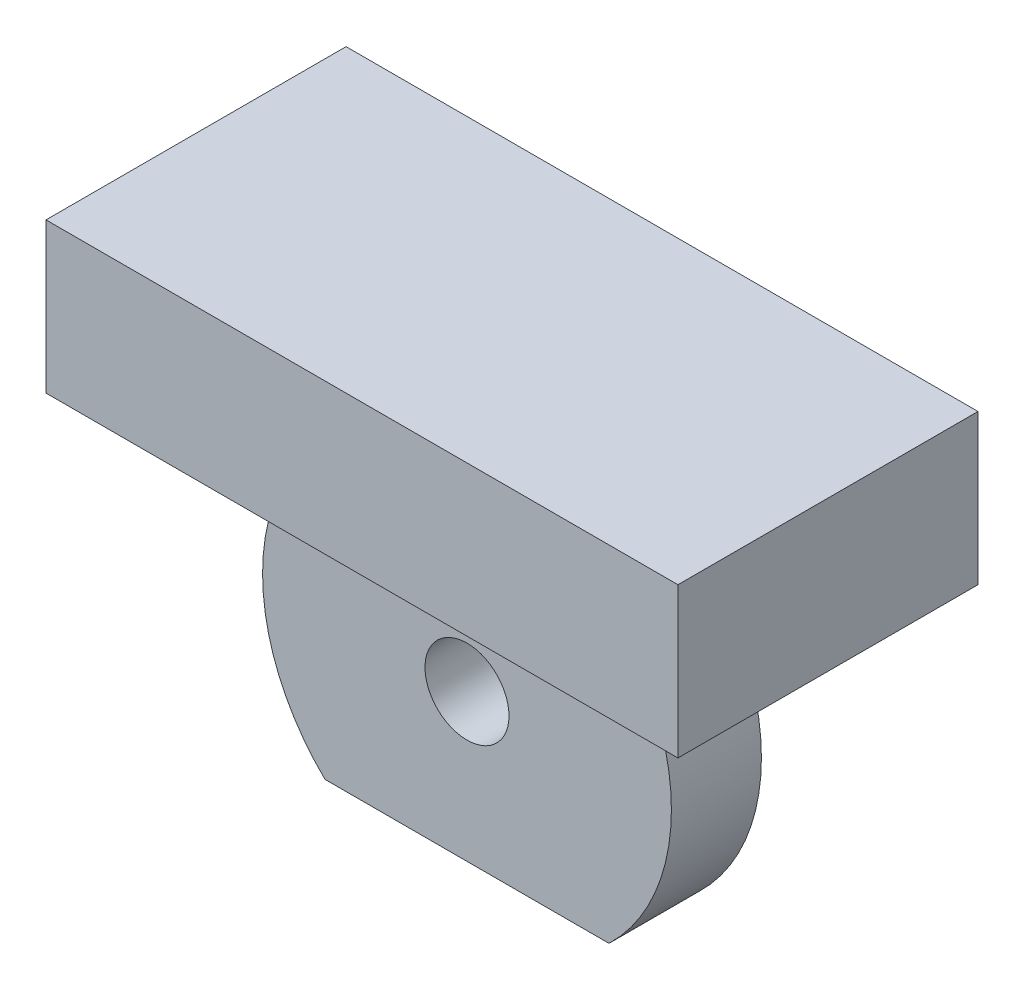
ISO-10303-21;
HEADER;
FILE_DESCRIPTION(('STEP AP214'),'2;1');
FILE_NAME('part.step','',(''),(''),'','','');
FILE_SCHEMA(('AUTOMOTIVE_DESIGN { 1 0 10303 214 1 1 1 1 }'));
ENDSEC;
DATA;
#1=APPLICATION_CONTEXT('core data for automotive mechanical design processes');
#2=APPLICATION_PROTOCOL_DEFINITION('international standard','automotive_design',2000,#1);
#3=PRODUCT_CONTEXT('',#1,'mechanical');
#4=PRODUCT('Part','Part','',(#3));
#5=PRODUCT_RELATED_PRODUCT_CATEGORY('part','',(#4));
#6=PRODUCT_DEFINITION_FORMATION('','',#4);
#7=PRODUCT_DEFINITION_CONTEXT('part definition',#1,'design');
#8=PRODUCT_DEFINITION('design','',#6,#7);
#9=PRODUCT_DEFINITION_SHAPE('','',#8);
#10=(LENGTH_UNIT() NAMED_UNIT(*) SI_UNIT(.MILLI.,.METRE.));
#11=(NAMED_UNIT(*) PLANE_ANGLE_UNIT() SI_UNIT($,.RADIAN.));
#12=(NAMED_UNIT(*) SI_UNIT($,.STERADIAN.) SOLID_ANGLE_UNIT());
#13=UNCERTAINTY_MEASURE_WITH_UNIT(LENGTH_MEASURE(1.E-05),#10,'distance_accuracy_value','');
#14=(GEOMETRIC_REPRESENTATION_CONTEXT(3) GLOBAL_UNCERTAINTY_ASSIGNED_CONTEXT((#13)) GLOBAL_UNIT_ASSIGNED_CONTEXT((#10,
#11,#12)) REPRESENTATION_CONTEXT('',''));
#15=CARTESIAN_POINT('',(0.,0.,0.));
#16=DIRECTION('',(0.,0.,1.));
#17=DIRECTION('',(1.,0.,0.));
#18=AXIS2_PLACEMENT_3D('',#15,#16,#17);
#19=CARTESIAN_POINT('',(0.,-10.,10.));
#20=DIRECTION('',(0.,1.,0.));
#21=DIRECTION('',(-1.,0.,0.));
#22=AXIS2_PLACEMENT_3D('',#19,#20,#21);
#23=PLANE('',#22);
#24=DIRECTION('',(1.,0.,0.));
#25=VECTOR('',#24,1.);
#26=CARTESIAN_POINT('',(0.,-10.,-10.));
#27=LINE('',#26,#25);
#28=CARTESIAN_POINT('',(0.,-10.,-10.));
#29=VERTEX_POINT('',#28);
#30=CARTESIAN_POINT('',(42.12,-10.,-10.));
#31=VERTEX_POINT('',#30);
#32=EDGE_CURVE('E149',#29,#31,#27,.T.);
#33=ORIENTED_EDGE('',*,*,#32,.T.);
#34=DIRECTION('',(0.,0.,-1.));
#35=VECTOR('',#34,1.);
#36=CARTESIAN_POINT('',(42.12,-10.,10.));
#37=LINE('',#36,#35);
#38=CARTESIAN_POINT('',(42.12,-10.,10.));
#39=VERTEX_POINT('',#38);
#40=EDGE_CURVE('E40',#39,#31,#37,.T.);
#41=ORIENTED_EDGE('',*,*,#40,.F.);
#42=DIRECTION('',(1.,0.,0.));
#43=VECTOR('',#42,1.);
#44=CARTESIAN_POINT('',(0.,-10.,10.));
#45=LINE('',#44,#43);
#46=CARTESIAN_POINT('',(0.,-10.,10.));
#47=VERTEX_POINT('',#46);
#48=EDGE_CURVE('E158',#47,#39,#45,.T.);
#49=ORIENTED_EDGE('',*,*,#48,.F.);
#50=DIRECTION('',(0.,0.,-1.));
#51=VECTOR('',#50,1.);
#52=CARTESIAN_POINT('',(0.,-10.,10.));
#53=LINE('',#52,#51);
#54=EDGE_CURVE('E11',#47,#29,#53,.T.);
#55=ORIENTED_EDGE('',*,*,#54,.T.);
#56=EDGE_LOOP('',(#33,#41,#49,#55));
#57=FACE_BOUND('',#56,.T.);
#58=DIRECTION('',(0.,0.,-1.));
#59=VECTOR('',#58,1.);
#60=CARTESIAN_POINT('',(39.6813836713903,-9.99999999999999,3.));
#61=LINE('',#60,#59);
#62=CARTESIAN_POINT('',(39.6813836713903,-10.,3.));
#63=VERTEX_POINT('',#62);
#64=CARTESIAN_POINT('',(39.6813836713903,-10.,-3.));
#65=VERTEX_POINT('',#64);
#66=EDGE_CURVE('E52',#63,#65,#61,.T.);
#67=ORIENTED_EDGE('',*,*,#66,.T.);
#68=DIRECTION('',(-1.,0.,0.));
#69=VECTOR('',#68,1.);
#70=CARTESIAN_POINT('',(2.43861632860968,-10.,-3.));
#71=LINE('',#70,#69);
#72=CARTESIAN_POINT('',(2.43861632860968,-10.,-3.));
#73=VERTEX_POINT('',#72);
#74=EDGE_CURVE('E273',#65,#73,#71,.T.);
#75=ORIENTED_EDGE('',*,*,#74,.T.);
#76=DIRECTION('',(0.,0.,-1.));
#77=VECTOR('',#76,1.);
#78=CARTESIAN_POINT('',(2.43861632860968,-10.,3.));
#79=LINE('',#78,#77);
#80=CARTESIAN_POINT('',(2.43861632860968,-10.,3.));
#81=VERTEX_POINT('',#80);
#82=EDGE_CURVE('E282',#81,#73,#79,.T.);
#83=ORIENTED_EDGE('',*,*,#82,.F.);
#84=DIRECTION('',(-1.,0.,0.));
#85=VECTOR('',#84,1.);
#86=CARTESIAN_POINT('',(2.43861632860968,-10.,3.));
#87=LINE('',#86,#85);
#88=EDGE_CURVE('E47',#63,#81,#87,.T.);
#89=ORIENTED_EDGE('',*,*,#88,.F.);
#90=EDGE_LOOP('',(#67,#75,#83,#89));
#91=FACE_BOUND('',#90,.T.);
#92=ADVANCED_FACE('F32',(#57,#91),#23,.F.);
#93=CARTESIAN_POINT('',(0.,0.,10.));
#94=DIRECTION('',(1.,0.,0.));
#95=DIRECTION('',(0.,1.,0.));
#96=AXIS2_PLACEMENT_3D('',#93,#94,#95);
#97=PLANE('',#96);
#98=DIRECTION('',(0.,-1.,0.));
#99=VECTOR('',#98,1.);
#100=CARTESIAN_POINT('',(0.,0.,-10.));
#101=LINE('',#100,#99);
#102=CARTESIAN_POINT('',(0.,0.,-10.));
#103=VERTEX_POINT('',#102);
#104=EDGE_CURVE('E146',#103,#29,#101,.T.);
#105=ORIENTED_EDGE('',*,*,#104,.T.);
#106=ORIENTED_EDGE('',*,*,#54,.F.);
#107=DIRECTION('',(0.,-1.,0.));
#108=VECTOR('',#107,1.);
#109=CARTESIAN_POINT('',(0.,0.,10.));
#110=LINE('',#109,#108);
#111=CARTESIAN_POINT('',(0.,0.,10.));
#112=VERTEX_POINT('',#111);
#113=EDGE_CURVE('E155',#112,#47,#110,.T.);
#114=ORIENTED_EDGE('',*,*,#113,.F.);
#115=DIRECTION('',(0.,0.,-1.));
#116=VECTOR('',#115,1.);
#117=CARTESIAN_POINT('',(0.,0.,10.));
#118=LINE('',#117,#116);
#119=EDGE_CURVE('E164',#112,#103,#118,.T.);
#120=ORIENTED_EDGE('',*,*,#119,.T.);
#121=EDGE_LOOP('',(#105,#106,#114,#120));
#122=FACE_BOUND('',#121,.T.);
#123=ADVANCED_FACE('F34',(#122),#97,.F.);
#124=CARTESIAN_POINT('',(42.12,0.,10.));
#125=DIRECTION('',(-1.,0.,0.));
#126=DIRECTION('',(0.,0.,1.));
#127=AXIS2_PLACEMENT_3D('',#124,#125,#126);
#128=PLANE('',#127);
#129=DIRECTION('',(0.,1.,0.));
#130=VECTOR('',#129,1.);
#131=CARTESIAN_POINT('',(42.12,0.,-10.));
#132=LINE('',#131,#130);
#133=CARTESIAN_POINT('',(42.12,0.,-10.));
#134=VERTEX_POINT('',#133);
#135=EDGE_CURVE('E167',#31,#134,#132,.T.);
#136=ORIENTED_EDGE('',*,*,#135,.T.);
#137=DIRECTION('',(0.,0.,-1.));
#138=VECTOR('',#137,1.);
#139=CARTESIAN_POINT('',(42.12,0.,10.));
#140=LINE('',#139,#138);
#141=CARTESIAN_POINT('',(42.12,0.,10.));
#142=VERTEX_POINT('',#141);
#143=EDGE_CURVE('E172',#142,#134,#140,.T.);
#144=ORIENTED_EDGE('',*,*,#143,.F.);
#145=DIRECTION('',(0.,1.,0.));
#146=VECTOR('',#145,1.);
#147=CARTESIAN_POINT('',(42.12,0.,10.));
#148=LINE('',#147,#146);
#149=EDGE_CURVE('E161',#39,#142,#148,.T.);
#150=ORIENTED_EDGE('',*,*,#149,.F.);
#151=ORIENTED_EDGE('',*,*,#40,.T.);
#152=EDGE_LOOP('',(#136,#144,#150,#151));
#153=FACE_BOUND('',#152,.T.);
#154=ADVANCED_FACE('F179',(#153),#128,.F.);
#155=CARTESIAN_POINT('',(0.,0.,10.));
#156=DIRECTION('',(0.,-1.,0.));
#157=DIRECTION('',(0.,0.,-1.));
#158=AXIS2_PLACEMENT_3D('',#155,#156,#157);
#159=PLANE('',#158);
#160=DIRECTION('',(-1.,0.,0.));
#161=VECTOR('',#160,1.);
#162=CARTESIAN_POINT('',(0.,0.,-10.));
#163=LINE('',#162,#161);
#164=EDGE_CURVE('E159',#134,#103,#163,.T.);
#165=ORIENTED_EDGE('',*,*,#164,.T.);
#166=ORIENTED_EDGE('',*,*,#119,.F.);
#167=DIRECTION('',(-1.,0.,0.));
#168=VECTOR('',#167,1.);
#169=CARTESIAN_POINT('',(0.,0.,10.));
#170=LINE('',#169,#168);
#171=EDGE_CURVE('E163',#142,#112,#170,.T.);
#172=ORIENTED_EDGE('',*,*,#171,.F.);
#173=ORIENTED_EDGE('',*,*,#143,.T.);
#174=EDGE_LOOP('',(#165,#166,#172,#173));
#175=FACE_BOUND('',#174,.T.);
#176=ADVANCED_FACE('F188',(#175),#159,.F.);
#177=CARTESIAN_POINT('',(0.,0.,10.));
#178=DIRECTION('',(0.,0.,1.));
#179=DIRECTION('',(1.,0.,0.));
#180=AXIS2_PLACEMENT_3D('',#177,#178,#179);
#181=PLANE('',#180);
#182=ORIENTED_EDGE('',*,*,#113,.T.);
#183=ORIENTED_EDGE('',*,*,#48,.T.);
#184=ORIENTED_EDGE('',*,*,#149,.T.);
#185=ORIENTED_EDGE('',*,*,#171,.T.);
#186=EDGE_LOOP('',(#182,#183,#184,#185));
#187=FACE_BOUND('',#186,.T.);
#188=ADVANCED_FACE('F194',(#187),#181,.T.);
#189=CARTESIAN_POINT('',(0.,0.,-10.));
#190=DIRECTION('',(0.,0.,1.));
#191=DIRECTION('',(1.,0.,0.));
#192=AXIS2_PLACEMENT_3D('',#189,#190,#191);
#193=PLANE('',#192);
#194=ORIENTED_EDGE('',*,*,#104,.F.);
#195=ORIENTED_EDGE('',*,*,#164,.F.);
#196=ORIENTED_EDGE('',*,*,#135,.F.);
#197=ORIENTED_EDGE('',*,*,#32,.F.);
#198=EDGE_LOOP('',(#194,#195,#196,#197));
#199=FACE_BOUND('',#198,.T.);
#200=ADVANCED_FACE('F185',(#199),#193,.F.);
#201=CARTESIAN_POINT('',(21.06,-20.2,3.));
#202=DIRECTION('',(0.,0.,-1.));
#203=DIRECTION('',(-1.,0.,0.));
#204=AXIS2_PLACEMENT_3D('',#201,#202,#203);
#205=PLANE('',#204);
#206=CARTESIAN_POINT('',(21.06,-20.2,3.));
#207=DIRECTION('',(0.,0.,1.));
#208=DIRECTION('',(-1.,0.,0.));
#209=AXIS2_PLACEMENT_3D('',#206,#207,#208);
#210=CIRCLE('',#209,13.624471549385);
#211=CARTESIAN_POINT('',(11.5743358166125,-10.42,3.));
#212=VERTEX_POINT('',#211);
#213=CARTESIAN_POINT('',(11.595,-30.,3.));
#214=VERTEX_POINT('',#213);
#215=EDGE_CURVE('E131',#212,#214,#210,.T.);
#216=ORIENTED_EDGE('',*,*,#215,.T.);
#217=DIRECTION('',(1.,0.,0.));
#218=VECTOR('',#217,1.);
#219=CARTESIAN_POINT('',(11.595,-30.,3.));
#220=LINE('',#219,#218);
#221=CARTESIAN_POINT('',(30.525,-30.,3.));
#222=VERTEX_POINT('',#221);
#223=EDGE_CURVE('E120',#214,#222,#220,.T.);
#224=ORIENTED_EDGE('',*,*,#223,.T.);
#225=CARTESIAN_POINT('',(21.06,-20.2,3.));
#226=DIRECTION('',(0.,0.,1.));
#227=DIRECTION('',(1.,0.,0.));
#228=AXIS2_PLACEMENT_3D('',#225,#226,#227);
#229=CIRCLE('',#228,13.6244715493849);
#230=CARTESIAN_POINT('',(30.5456641833875,-10.42,3.));
#231=VERTEX_POINT('',#230);
#232=EDGE_CURVE('E130',#222,#231,#229,.T.);
#233=ORIENTED_EDGE('',*,*,#232,.T.);
#234=DIRECTION('',(1.,0.,0.));
#235=VECTOR('',#234,1.);
#236=CARTESIAN_POINT('',(30.5456641833875,-10.42,3.));
#237=LINE('',#236,#235);
#238=CARTESIAN_POINT('',(39.6813836713903,-10.42,3.));
#239=VERTEX_POINT('',#238);
#240=EDGE_CURVE('E255',#231,#239,#237,.T.);
#241=ORIENTED_EDGE('',*,*,#240,.T.);
#242=DIRECTION('',(0.,1.,0.));
#243=VECTOR('',#242,1.);
#244=CARTESIAN_POINT('',(39.6813836713903,-10.42,3.));
#245=LINE('',#244,#243);
#246=EDGE_CURVE('E257',#239,#63,#245,.T.);
#247=ORIENTED_EDGE('',*,*,#246,.T.);
#248=ORIENTED_EDGE('',*,*,#88,.T.);
#249=DIRECTION('',(0.,-1.,0.));
#250=VECTOR('',#249,1.);
#251=CARTESIAN_POINT('',(2.43861632860968,-10.42,3.));
#252=LINE('',#251,#250);
#253=CARTESIAN_POINT('',(2.43861632860968,-10.42,3.));
#254=VERTEX_POINT('',#253);
#255=EDGE_CURVE('E260',#81,#254,#252,.T.);
#256=ORIENTED_EDGE('',*,*,#255,.T.);
#257=DIRECTION('',(1.,0.,0.));
#258=VECTOR('',#257,1.);
#259=CARTESIAN_POINT('',(11.5743358166125,-10.42,3.));
#260=LINE('',#259,#258);
#261=EDGE_CURVE('E137',#254,#212,#260,.T.);
#262=ORIENTED_EDGE('',*,*,#261,.T.);
#263=EDGE_LOOP('',(#216,#224,#233,#241,#247,#248,#256,#262));
#264=FACE_BOUND('',#263,.T.);
#265=CARTESIAN_POINT('',(21.06,-20.2,3.));
#266=DIRECTION('',(0.,0.,1.));
#267=DIRECTION('',(1.,0.,0.));
#268=AXIS2_PLACEMENT_3D('',#265,#266,#267);
#269=CIRCLE('',#268,2.8);
#270=CARTESIAN_POINT('',(23.86,-20.2,3.));
#271=VERTEX_POINT('',#270);
#272=EDGE_CURVE('E246',#271,#271,#269,.T.);
#273=ORIENTED_EDGE('',*,*,#272,.F.);
#274=EDGE_LOOP('',(#273));
#275=FACE_BOUND('',#274,.T.);
#276=ADVANCED_FACE('F134',(#264,#275),#205,.F.);
#277=CARTESIAN_POINT('',(21.06,-20.2,-3.));
#278=DIRECTION('',(0.,0.,-1.));
#279=DIRECTION('',(-1.,0.,0.));
#280=AXIS2_PLACEMENT_3D('',#277,#278,#279);
#281=PLANE('',#280);
#282=CARTESIAN_POINT('',(21.06,-20.2,-3.));
#283=DIRECTION('',(0.,0.,1.));
#284=DIRECTION('',(-1.,0.,0.));
#285=AXIS2_PLACEMENT_3D('',#282,#283,#284);
#286=CIRCLE('',#285,13.624471549385);
#287=CARTESIAN_POINT('',(11.5743358166125,-10.42,-3.));
#288=VERTEX_POINT('',#287);
#289=CARTESIAN_POINT('',(11.595,-30.,-3.));
#290=VERTEX_POINT('',#289);
#291=EDGE_CURVE('E145',#288,#290,#286,.T.);
#292=ORIENTED_EDGE('',*,*,#291,.F.);
#293=DIRECTION('',(1.,0.,0.));
#294=VECTOR('',#293,1.);
#295=CARTESIAN_POINT('',(11.5743358166125,-10.42,-3.));
#296=LINE('',#295,#294);
#297=CARTESIAN_POINT('',(2.43861632860968,-10.42,-3.));
#298=VERTEX_POINT('',#297);
#299=EDGE_CURVE('E141',#298,#288,#296,.T.);
#300=ORIENTED_EDGE('',*,*,#299,.F.);
#301=DIRECTION('',(0.,-1.,0.));
#302=VECTOR('',#301,1.);
#303=CARTESIAN_POINT('',(2.43861632860968,-10.42,-3.));
#304=LINE('',#303,#302);
#305=EDGE_CURVE('E275',#73,#298,#304,.T.);
#306=ORIENTED_EDGE('',*,*,#305,.F.);
#307=ORIENTED_EDGE('',*,*,#74,.F.);
#308=DIRECTION('',(0.,1.,0.));
#309=VECTOR('',#308,1.);
#310=CARTESIAN_POINT('',(39.6813836713903,-10.42,-3.));
#311=LINE('',#310,#309);
#312=CARTESIAN_POINT('',(39.6813836713903,-10.42,-3.));
#313=VERTEX_POINT('',#312);
#314=EDGE_CURVE('E271',#313,#65,#311,.T.);
#315=ORIENTED_EDGE('',*,*,#314,.F.);
#316=DIRECTION('',(1.,0.,0.));
#317=VECTOR('',#316,1.);
#318=CARTESIAN_POINT('',(30.5456641833875,-10.42,-3.));
#319=LINE('',#318,#317);
#320=CARTESIAN_POINT('',(30.5456641833875,-10.42,-3.));
#321=VERTEX_POINT('',#320);
#322=EDGE_CURVE('E269',#321,#313,#319,.T.);
#323=ORIENTED_EDGE('',*,*,#322,.F.);
#324=CARTESIAN_POINT('',(21.06,-20.2,-3.));
#325=DIRECTION('',(0.,0.,1.));
#326=DIRECTION('',(1.,0.,0.));
#327=AXIS2_PLACEMENT_3D('',#324,#325,#326);
#328=CIRCLE('',#327,13.6244715493849);
#329=CARTESIAN_POINT('',(30.525,-30.,-3.));
#330=VERTEX_POINT('',#329);
#331=EDGE_CURVE('E267',#330,#321,#328,.T.);
#332=ORIENTED_EDGE('',*,*,#331,.F.);
#333=DIRECTION('',(1.,0.,0.));
#334=VECTOR('',#333,1.);
#335=CARTESIAN_POINT('',(11.595,-30.,-3.));
#336=LINE('',#335,#334);
#337=EDGE_CURVE('E265',#290,#330,#336,.T.);
#338=ORIENTED_EDGE('',*,*,#337,.F.);
#339=EDGE_LOOP('',(#292,#300,#306,#307,#315,#323,#332,#338));
#340=FACE_BOUND('',#339,.T.);
#341=CARTESIAN_POINT('',(21.06,-20.2,-3.));
#342=DIRECTION('',(0.,0.,1.));
#343=DIRECTION('',(1.,0.,0.));
#344=AXIS2_PLACEMENT_3D('',#341,#342,#343);
#345=CIRCLE('',#344,2.8);
#346=CARTESIAN_POINT('',(23.86,-20.2,-3.));
#347=VERTEX_POINT('',#346);
#348=EDGE_CURVE('E249',#347,#347,#345,.T.);
#349=ORIENTED_EDGE('',*,*,#348,.T.);
#350=EDGE_LOOP('',(#349));
#351=FACE_BOUND('',#350,.T.);
#352=ADVANCED_FACE('F210',(#340,#351),#281,.T.);
#353=CARTESIAN_POINT('',(21.06,-20.2,3.));
#354=DIRECTION('',(0.,0.,-1.));
#355=DIRECTION('',(-1.,0.,0.));
#356=AXIS2_PLACEMENT_3D('',#353,#354,#355);
#357=CYLINDRICAL_SURFACE('',#356,13.624471549385);
#358=ORIENTED_EDGE('',*,*,#291,.T.);
#359=DIRECTION('',(0.,0.,-1.));
#360=VECTOR('',#359,1.);
#361=CARTESIAN_POINT('',(11.595,-30.,3.));
#362=LINE('',#361,#360);
#363=EDGE_CURVE('E124',#214,#290,#362,.T.);
#364=ORIENTED_EDGE('',*,*,#363,.F.);
#365=ORIENTED_EDGE('',*,*,#215,.F.);
#366=DIRECTION('',(0.,0.,-1.));
#367=VECTOR('',#366,1.);
#368=CARTESIAN_POINT('',(11.5743358166125,-10.42,3.));
#369=LINE('',#368,#367);
#370=EDGE_CURVE('E263',#212,#288,#369,.T.);
#371=ORIENTED_EDGE('',*,*,#370,.T.);
#372=EDGE_LOOP('',(#358,#364,#365,#371));
#373=FACE_BOUND('',#372,.T.);
#374=ADVANCED_FACE('F143',(#373),#357,.T.);
#375=CARTESIAN_POINT('',(11.595,-30.,3.));
#376=DIRECTION('',(0.,1.,0.));
#377=DIRECTION('',(-1.,0.,0.));
#378=AXIS2_PLACEMENT_3D('',#375,#376,#377);
#379=PLANE('',#378);
#380=ORIENTED_EDGE('',*,*,#337,.T.);
#381=DIRECTION('',(0.,0.,-1.));
#382=VECTOR('',#381,1.);
#383=CARTESIAN_POINT('',(30.525,-30.,3.));
#384=LINE('',#383,#382);
#385=EDGE_CURVE('E127',#222,#330,#384,.T.);
#386=ORIENTED_EDGE('',*,*,#385,.F.);
#387=ORIENTED_EDGE('',*,*,#223,.F.);
#388=ORIENTED_EDGE('',*,*,#363,.T.);
#389=EDGE_LOOP('',(#380,#386,#387,#388));
#390=FACE_BOUND('',#389,.T.);
#391=ADVANCED_FACE('F122',(#390),#379,.F.);
#392=CARTESIAN_POINT('',(21.06,-20.2,3.));
#393=DIRECTION('',(0.,0.,-1.));
#394=DIRECTION('',(-1.,0.,0.));
#395=AXIS2_PLACEMENT_3D('',#392,#393,#394);
#396=CYLINDRICAL_SURFACE('',#395,13.6244715493849);
#397=ORIENTED_EDGE('',*,*,#331,.T.);
#398=DIRECTION('',(0.,0.,-1.));
#399=VECTOR('',#398,1.);
#400=CARTESIAN_POINT('',(30.5456641833875,-10.42,3.));
#401=LINE('',#400,#399);
#402=EDGE_CURVE('E151',#231,#321,#401,.T.);
#403=ORIENTED_EDGE('',*,*,#402,.F.);
#404=ORIENTED_EDGE('',*,*,#232,.F.);
#405=ORIENTED_EDGE('',*,*,#385,.T.);
#406=EDGE_LOOP('',(#397,#403,#404,#405));
#407=FACE_BOUND('',#406,.T.);
#408=ADVANCED_FACE('F213',(#407),#396,.T.);
#409=CARTESIAN_POINT('',(30.5456641833875,-10.42,3.));
#410=DIRECTION('',(0.,1.,0.));
#411=DIRECTION('',(-1.,0.,0.));
#412=AXIS2_PLACEMENT_3D('',#409,#410,#411);
#413=PLANE('',#412);
#414=ORIENTED_EDGE('',*,*,#322,.T.);
#415=DIRECTION('',(0.,0.,-1.));
#416=VECTOR('',#415,1.);
#417=CARTESIAN_POINT('',(39.6813836713903,-10.42,3.));
#418=LINE('',#417,#416);
#419=EDGE_CURVE('E286',#239,#313,#418,.T.);
#420=ORIENTED_EDGE('',*,*,#419,.F.);
#421=ORIENTED_EDGE('',*,*,#240,.F.);
#422=ORIENTED_EDGE('',*,*,#402,.T.);
#423=EDGE_LOOP('',(#414,#420,#421,#422));
#424=FACE_BOUND('',#423,.T.);
#425=ADVANCED_FACE('F216',(#424),#413,.F.);
#426=CARTESIAN_POINT('',(39.6813836713903,-10.42,3.));
#427=DIRECTION('',(-1.,0.,0.));
#428=DIRECTION('',(0.,0.,1.));
#429=AXIS2_PLACEMENT_3D('',#426,#427,#428);
#430=PLANE('',#429);
#431=ORIENTED_EDGE('',*,*,#314,.T.);
#432=ORIENTED_EDGE('',*,*,#66,.F.);
#433=ORIENTED_EDGE('',*,*,#246,.F.);
#434=ORIENTED_EDGE('',*,*,#419,.T.);
#435=EDGE_LOOP('',(#431,#432,#433,#434));
#436=FACE_BOUND('',#435,.T.);
#437=ADVANCED_FACE('F220',(#436),#430,.F.);
#438=CARTESIAN_POINT('',(2.43861632860968,-10.42,3.));
#439=DIRECTION('',(1.,0.,0.));
#440=DIRECTION('',(0.,0.,-1.));
#441=AXIS2_PLACEMENT_3D('',#438,#439,#440);
#442=PLANE('',#441);
#443=ORIENTED_EDGE('',*,*,#305,.T.);
#444=DIRECTION('',(0.,0.,-1.));
#445=VECTOR('',#444,1.);
#446=CARTESIAN_POINT('',(2.43861632860968,-10.42,3.));
#447=LINE('',#446,#445);
#448=EDGE_CURVE('E279',#254,#298,#447,.T.);
#449=ORIENTED_EDGE('',*,*,#448,.F.);
#450=ORIENTED_EDGE('',*,*,#255,.F.);
#451=ORIENTED_EDGE('',*,*,#82,.T.);
#452=EDGE_LOOP('',(#443,#449,#450,#451));
#453=FACE_BOUND('',#452,.T.);
#454=ADVANCED_FACE('F224',(#453),#442,.F.);
#455=CARTESIAN_POINT('',(11.5743358166125,-10.42,3.));
#456=DIRECTION('',(0.,1.,0.));
#457=DIRECTION('',(-1.,0.,0.));
#458=AXIS2_PLACEMENT_3D('',#455,#456,#457);
#459=PLANE('',#458);
#460=ORIENTED_EDGE('',*,*,#299,.T.);
#461=ORIENTED_EDGE('',*,*,#370,.F.);
#462=ORIENTED_EDGE('',*,*,#261,.F.);
#463=ORIENTED_EDGE('',*,*,#448,.T.);
#464=EDGE_LOOP('',(#460,#461,#462,#463));
#465=FACE_BOUND('',#464,.T.);
#466=ADVANCED_FACE('F228',(#465),#459,.F.);
#467=CARTESIAN_POINT('',(21.06,-20.2,3.));
#468=DIRECTION('',(0.,0.,-1.));
#469=DIRECTION('',(-1.,0.,0.));
#470=AXIS2_PLACEMENT_3D('',#467,#468,#469);
#471=CYLINDRICAL_SURFACE('',#470,2.8);
#472=ORIENTED_EDGE('',*,*,#272,.T.);
#473=EDGE_LOOP('',(#472));
#474=FACE_BOUND('',#473,.T.);
#475=ORIENTED_EDGE('',*,*,#348,.F.);
#476=EDGE_LOOP('',(#475));
#477=FACE_BOUND('',#476,.T.);
#478=ADVANCED_FACE('F232',(#474,#477),#471,.F.);
#479=CLOSED_SHELL('',(#92,#123,#154,#176,#188,#200,#276,#352,#374,#391,#408,#425,#437,#454,#466,#478));
#480=MANIFOLD_SOLID_BREP('B2',#479);
#481=ADVANCED_BREP_SHAPE_REPRESENTATION('',(#18,#480),#14);
#482=SHAPE_DEFINITION_REPRESENTATION(#9,#481);
ENDSEC;
END-ISO-10303-21;
